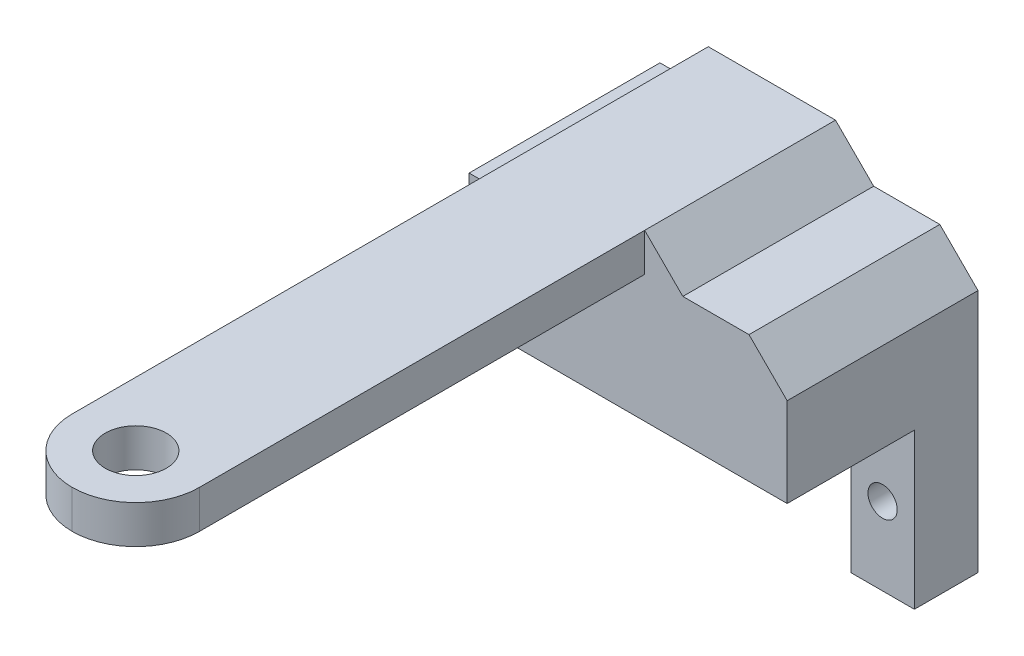
ISO-10303-21;
HEADER;
FILE_DESCRIPTION(('STEP AP214'),'2;1');
FILE_NAME('part.step','',(''),(''),'','','');
FILE_SCHEMA(('AUTOMOTIVE_DESIGN { 1 0 10303 214 1 1 1 1 }'));
ENDSEC;
DATA;
#1=APPLICATION_CONTEXT('core data for automotive mechanical design processes');
#2=APPLICATION_PROTOCOL_DEFINITION('international standard','automotive_design',2000,#1);
#3=PRODUCT_CONTEXT('',#1,'mechanical');
#4=PRODUCT('Part','Part','',(#3));
#5=PRODUCT_RELATED_PRODUCT_CATEGORY('part','',(#4));
#6=PRODUCT_DEFINITION_FORMATION('','',#4);
#7=PRODUCT_DEFINITION_CONTEXT('part definition',#1,'design');
#8=PRODUCT_DEFINITION('design','',#6,#7);
#9=PRODUCT_DEFINITION_SHAPE('','',#8);
#10=(LENGTH_UNIT() NAMED_UNIT(*) SI_UNIT(.MILLI.,.METRE.));
#11=(NAMED_UNIT(*) PLANE_ANGLE_UNIT() SI_UNIT($,.RADIAN.));
#12=(NAMED_UNIT(*) SI_UNIT($,.STERADIAN.) SOLID_ANGLE_UNIT());
#13=UNCERTAINTY_MEASURE_WITH_UNIT(LENGTH_MEASURE(1.E-05),#10,'distance_accuracy_value','');
#14=(GEOMETRIC_REPRESENTATION_CONTEXT(3) GLOBAL_UNCERTAINTY_ASSIGNED_CONTEXT((#13)) GLOBAL_UNIT_ASSIGNED_CONTEXT((#10,
#11,#12)) REPRESENTATION_CONTEXT('',''));
#15=CARTESIAN_POINT('',(0.,0.,0.));
#16=DIRECTION('',(0.,0.,1.));
#17=DIRECTION('',(1.,0.,0.));
#18=AXIS2_PLACEMENT_3D('',#15,#16,#17);
#19=CARTESIAN_POINT('',(0.,10.,0.));
#20=DIRECTION('',(0.,-1.,0.));
#21=DIRECTION('',(0.,0.,-1.));
#22=AXIS2_PLACEMENT_3D('',#19,#20,#21);
#23=PLANE('',#22);
#24=DIRECTION('',(1.,0.,0.));
#25=VECTOR('',#24,1.);
#26=CARTESIAN_POINT('',(16.2,10.,15.));
#27=LINE('',#26,#25);
#28=CARTESIAN_POINT('',(-8.8,10.,15.));
#29=VERTEX_POINT('',#28);
#30=CARTESIAN_POINT('',(-7.99999999999999,10.,15.));
#31=VERTEX_POINT('',#30);
#32=EDGE_CURVE('E199',#29,#31,#27,.T.);
#33=ORIENTED_EDGE('',*,*,#32,.T.);
#34=DIRECTION('',(0.,0.,-1.));
#35=VECTOR('',#34,1.);
#36=CARTESIAN_POINT('',(-7.99999999999999,10.,0.));
#37=LINE('',#36,#35);
#38=CARTESIAN_POINT('',(-7.99999999999999,10.,0.));
#39=VERTEX_POINT('',#38);
#40=EDGE_CURVE('E273',#31,#39,#37,.T.);
#41=ORIENTED_EDGE('',*,*,#40,.T.);
#42=DIRECTION('',(-1.,0.,0.));
#43=VECTOR('',#42,1.);
#44=CARTESIAN_POINT('',(16.2,10.,0.));
#45=LINE('',#44,#43);
#46=CARTESIAN_POINT('',(-8.8,10.,0.));
#47=VERTEX_POINT('',#46);
#48=EDGE_CURVE('E186',#39,#47,#45,.T.);
#49=ORIENTED_EDGE('',*,*,#48,.T.);
#50=DIRECTION('',(0.,0.,1.));
#51=VECTOR('',#50,1.);
#52=CARTESIAN_POINT('',(-8.8,10.,0.));
#53=LINE('',#52,#51);
#54=EDGE_CURVE('E194',#47,#29,#53,.T.);
#55=ORIENTED_EDGE('',*,*,#54,.T.);
#56=EDGE_LOOP('',(#33,#41,#49,#55));
#57=FACE_BOUND('',#56,.T.);
#58=ADVANCED_FACE('F41',(#57),#23,.F.);
#59=CARTESIAN_POINT('',(7.99999999999999,10.,15.));
#60=VERTEX_POINT('',#59);
#61=CARTESIAN_POINT('',(13.2,10.,15.));
#62=VERTEX_POINT('',#61);
#63=EDGE_CURVE('E193',#60,#62,#27,.T.);
#64=ORIENTED_EDGE('',*,*,#63,.T.);
#65=DIRECTION('',(0.,0.,-1.));
#66=VECTOR('',#65,1.);
#67=CARTESIAN_POINT('',(13.2,10.,0.));
#68=LINE('',#67,#66);
#69=CARTESIAN_POINT('',(13.2,10.,0.));
#70=VERTEX_POINT('',#69);
#71=EDGE_CURVE('E263',#62,#70,#68,.T.);
#72=ORIENTED_EDGE('',*,*,#71,.T.);
#73=CARTESIAN_POINT('',(7.99999999999999,10.,0.));
#74=VERTEX_POINT('',#73);
#75=EDGE_CURVE('E192',#70,#74,#45,.T.);
#76=ORIENTED_EDGE('',*,*,#75,.T.);
#77=DIRECTION('',(0.,0.,1.));
#78=VECTOR('',#77,1.);
#79=CARTESIAN_POINT('',(7.99999999999999,10.,15.));
#80=LINE('',#79,#78);
#81=EDGE_CURVE('E152',#74,#60,#80,.T.);
#82=ORIENTED_EDGE('',*,*,#81,.T.);
#83=EDGE_LOOP('',(#64,#72,#76,#82));
#84=FACE_BOUND('',#83,.T.);
#85=ADVANCED_FACE('F316',(#84),#23,.F.);
#86=CARTESIAN_POINT('',(11.2,-12.2,0.));
#87=DIRECTION('',(-1.,0.,0.));
#88=DIRECTION('',(0.,0.,1.));
#89=AXIS2_PLACEMENT_3D('',#86,#87,#88);
#90=PLANE('',#89);
#91=DIRECTION('',(0.,0.,1.));
#92=VECTOR('',#91,1.);
#93=CARTESIAN_POINT('',(11.2,0.,0.));
#94=LINE('',#93,#92);
#95=CARTESIAN_POINT('',(11.2,0.,0.));
#96=VERTEX_POINT('',#95);
#97=CARTESIAN_POINT('',(11.2,0.,5.));
#98=VERTEX_POINT('',#97);
#99=EDGE_CURVE('E216',#96,#98,#94,.T.);
#100=ORIENTED_EDGE('',*,*,#99,.F.);
#101=DIRECTION('',(0.,1.,0.));
#102=VECTOR('',#101,1.);
#103=CARTESIAN_POINT('',(11.2,-12.2,0.));
#104=LINE('',#103,#102);
#105=CARTESIAN_POINT('',(11.2,-12.2,0.));
#106=VERTEX_POINT('',#105);
#107=EDGE_CURVE('E238',#106,#96,#104,.T.);
#108=ORIENTED_EDGE('',*,*,#107,.F.);
#109=DIRECTION('',(0.,0.,1.));
#110=VECTOR('',#109,1.);
#111=CARTESIAN_POINT('',(11.2,-12.2,0.));
#112=LINE('',#111,#110);
#113=CARTESIAN_POINT('',(11.2,-12.2,5.));
#114=VERTEX_POINT('',#113);
#115=EDGE_CURVE('E217',#106,#114,#112,.T.);
#116=ORIENTED_EDGE('',*,*,#115,.T.);
#117=DIRECTION('',(0.,1.,0.));
#118=VECTOR('',#117,1.);
#119=CARTESIAN_POINT('',(11.2,-12.2,5.));
#120=LINE('',#119,#118);
#121=EDGE_CURVE('E231',#114,#98,#120,.T.);
#122=ORIENTED_EDGE('',*,*,#121,.T.);
#123=EDGE_LOOP('',(#100,#108,#116,#122));
#124=FACE_BOUND('',#123,.T.);
#125=ADVANCED_FACE('F323',(#124),#90,.T.);
#126=CARTESIAN_POINT('',(11.2,-12.2,0.));
#127=DIRECTION('',(0.,0.,-1.));
#128=DIRECTION('',(-1.,0.,0.));
#129=AXIS2_PLACEMENT_3D('',#126,#127,#128);
#130=PLANE('',#129);
#131=CARTESIAN_POINT('',(13.7,-6.1,0.));
#132=DIRECTION('',(0.,0.,-1.));
#133=DIRECTION('',(-1.,0.,0.));
#134=AXIS2_PLACEMENT_3D('',#131,#132,#133);
#135=CIRCLE('',#134,1.15);
#136=CARTESIAN_POINT('',(12.55,-6.1,0.));
#137=VERTEX_POINT('',#136);
#138=EDGE_CURVE('E211',#137,#137,#135,.T.);
#139=ORIENTED_EDGE('',*,*,#138,.F.);
#140=EDGE_LOOP('',(#139));
#141=FACE_BOUND('',#140,.T.);
#142=ORIENTED_EDGE('',*,*,#75,.F.);
#143=DIRECTION('',(0.707106781186546,-0.707106781186549,0.));
#144=VECTOR('',#143,1.);
#145=CARTESIAN_POINT('',(23.3,-0.100000000000053,0.));
#146=LINE('',#145,#144);
#147=CARTESIAN_POINT('',(16.2,7.,0.));
#148=VERTEX_POINT('',#147);
#149=EDGE_CURVE('E270',#70,#148,#146,.T.);
#150=ORIENTED_EDGE('',*,*,#149,.T.);
#151=DIRECTION('',(0.,1.,0.));
#152=VECTOR('',#151,1.);
#153=CARTESIAN_POINT('',(16.2,-12.2,0.));
#154=LINE('',#153,#152);
#155=CARTESIAN_POINT('',(16.2,-12.2,0.));
#156=VERTEX_POINT('',#155);
#157=EDGE_CURVE('E241',#156,#148,#154,.T.);
#158=ORIENTED_EDGE('',*,*,#157,.F.);
#159=DIRECTION('',(-1.,0.,0.));
#160=VECTOR('',#159,1.);
#161=CARTESIAN_POINT('',(11.2,-12.2,0.));
#162=LINE('',#161,#160);
#163=EDGE_CURVE('E229',#156,#106,#162,.T.);
#164=ORIENTED_EDGE('',*,*,#163,.T.);
#165=ORIENTED_EDGE('',*,*,#107,.T.);
#166=DIRECTION('',(-1.,0.,0.));
#167=VECTOR('',#166,1.);
#168=CARTESIAN_POINT('',(16.2,0.,0.));
#169=LINE('',#168,#167);
#170=CARTESIAN_POINT('',(-8.8,0.,0.));
#171=VERTEX_POINT('',#170);
#172=EDGE_CURVE('E178',#96,#171,#169,.T.);
#173=ORIENTED_EDGE('',*,*,#172,.T.);
#174=DIRECTION('',(0.,-1.,0.));
#175=VECTOR('',#174,1.);
#176=CARTESIAN_POINT('',(-8.8,10.,0.));
#177=LINE('',#176,#175);
#178=EDGE_CURVE('E208',#47,#171,#177,.T.);
#179=ORIENTED_EDGE('',*,*,#178,.F.);
#180=ORIENTED_EDGE('',*,*,#48,.F.);
#181=DIRECTION('',(-0.707106781186544,-0.707106781186551,0.));
#182=VECTOR('',#181,1.);
#183=CARTESIAN_POINT('',(-5.,13.,0.));
#184=LINE('',#183,#182);
#185=CARTESIAN_POINT('',(-5.,13.,0.));
#186=VERTEX_POINT('',#185);
#187=EDGE_CURVE('E159',#39,#186,#184,.F.);
#188=ORIENTED_EDGE('',*,*,#187,.T.);
#189=DIRECTION('',(-1.,0.,0.));
#190=VECTOR('',#189,1.);
#191=CARTESIAN_POINT('',(-5.,13.,0.));
#192=LINE('',#191,#190);
#193=CARTESIAN_POINT('',(5.,13.,0.));
#194=VERTEX_POINT('',#193);
#195=EDGE_CURVE('E168',#194,#186,#192,.T.);
#196=ORIENTED_EDGE('',*,*,#195,.F.);
#197=DIRECTION('',(-0.707106781186544,0.707106781186551,0.));
#198=VECTOR('',#197,1.);
#199=CARTESIAN_POINT('',(5.,13.,0.));
#200=LINE('',#199,#198);
#201=EDGE_CURVE('E49',#194,#74,#200,.F.);
#202=ORIENTED_EDGE('',*,*,#201,.T.);
#203=EDGE_LOOP('',(#142,#150,#158,#164,#165,#173,#179,#180,#188,#196,#202));
#204=FACE_BOUND('',#203,.T.);
#205=ADVANCED_FACE('F175',(#141,#204),#130,.T.);
#206=CARTESIAN_POINT('',(16.2,-12.2,0.));
#207=DIRECTION('',(1.,0.,0.));
#208=DIRECTION('',(0.,0.,-1.));
#209=AXIS2_PLACEMENT_3D('',#206,#207,#208);
#210=PLANE('',#209);
#211=ORIENTED_EDGE('',*,*,#157,.T.);
#212=DIRECTION('',(0.,0.,1.));
#213=VECTOR('',#212,1.);
#214=CARTESIAN_POINT('',(16.2,7.,15.));
#215=LINE('',#214,#213);
#216=CARTESIAN_POINT('',(16.2,7.,15.));
#217=VERTEX_POINT('',#216);
#218=EDGE_CURVE('E267',#148,#217,#215,.T.);
#219=ORIENTED_EDGE('',*,*,#218,.T.);
#220=DIRECTION('',(0.,-1.,0.));
#221=VECTOR('',#220,1.);
#222=CARTESIAN_POINT('',(16.2,10.,15.));
#223=LINE('',#222,#221);
#224=CARTESIAN_POINT('',(16.2,0.,15.));
#225=VERTEX_POINT('',#224);
#226=EDGE_CURVE('E200',#217,#225,#223,.T.);
#227=ORIENTED_EDGE('',*,*,#226,.T.);
#228=DIRECTION('',(0.,0.,-1.));
#229=VECTOR('',#228,1.);
#230=CARTESIAN_POINT('',(16.2,0.,0.));
#231=LINE('',#230,#229);
#232=CARTESIAN_POINT('',(16.2,0.,5.));
#233=VERTEX_POINT('',#232);
#234=EDGE_CURVE('E174',#225,#233,#231,.T.);
#235=ORIENTED_EDGE('',*,*,#234,.T.);
#236=DIRECTION('',(0.,1.,0.));
#237=VECTOR('',#236,1.);
#238=CARTESIAN_POINT('',(16.2,-12.2,5.));
#239=LINE('',#238,#237);
#240=CARTESIAN_POINT('',(16.2,-12.2,5.));
#241=VERTEX_POINT('',#240);
#242=EDGE_CURVE('E242',#241,#233,#239,.T.);
#243=ORIENTED_EDGE('',*,*,#242,.F.);
#244=DIRECTION('',(0.,0.,-1.));
#245=VECTOR('',#244,1.);
#246=CARTESIAN_POINT('',(16.2,-12.2,0.));
#247=LINE('',#246,#245);
#248=EDGE_CURVE('E227',#241,#156,#247,.T.);
#249=ORIENTED_EDGE('',*,*,#248,.T.);
#250=EDGE_LOOP('',(#211,#219,#227,#235,#243,#249));
#251=FACE_BOUND('',#250,.T.);
#252=ADVANCED_FACE('F353',(#251),#210,.T.);
#253=CARTESIAN_POINT('',(11.2,-12.2,5.));
#254=DIRECTION('',(0.,0.,1.));
#255=DIRECTION('',(1.,0.,0.));
#256=AXIS2_PLACEMENT_3D('',#253,#254,#255);
#257=PLANE('',#256);
#258=CARTESIAN_POINT('',(13.7,-6.1,5.));
#259=DIRECTION('',(0.,0.,1.));
#260=DIRECTION('',(1.,0.,0.));
#261=AXIS2_PLACEMENT_3D('',#258,#259,#260);
#262=CIRCLE('',#261,1.15);
#263=CARTESIAN_POINT('',(14.85,-6.1,5.));
#264=VERTEX_POINT('',#263);
#265=EDGE_CURVE('E214',#264,#264,#262,.F.);
#266=ORIENTED_EDGE('',*,*,#265,.T.);
#267=EDGE_LOOP('',(#266));
#268=FACE_BOUND('',#267,.T.);
#269=DIRECTION('',(1.,0.,0.));
#270=VECTOR('',#269,1.);
#271=CARTESIAN_POINT('',(11.2,0.,5.));
#272=LINE('',#271,#270);
#273=EDGE_CURVE('E222',#98,#233,#272,.T.);
#274=ORIENTED_EDGE('',*,*,#273,.F.);
#275=ORIENTED_EDGE('',*,*,#121,.F.);
#276=DIRECTION('',(1.,0.,0.));
#277=VECTOR('',#276,1.);
#278=CARTESIAN_POINT('',(11.2,-12.2,5.));
#279=LINE('',#278,#277);
#280=EDGE_CURVE('E221',#114,#241,#279,.T.);
#281=ORIENTED_EDGE('',*,*,#280,.T.);
#282=ORIENTED_EDGE('',*,*,#242,.T.);
#283=EDGE_LOOP('',(#274,#275,#281,#282));
#284=FACE_BOUND('',#283,.T.);
#285=ADVANCED_FACE('F346',(#268,#284),#257,.T.);
#286=CARTESIAN_POINT('',(0.,-12.2,0.));
#287=DIRECTION('',(0.,1.,0.));
#288=DIRECTION('',(0.,0.,1.));
#289=AXIS2_PLACEMENT_3D('',#286,#287,#288);
#290=PLANE('',#289);
#291=ORIENTED_EDGE('',*,*,#115,.F.);
#292=ORIENTED_EDGE('',*,*,#163,.F.);
#293=ORIENTED_EDGE('',*,*,#248,.F.);
#294=ORIENTED_EDGE('',*,*,#280,.F.);
#295=EDGE_LOOP('',(#291,#292,#293,#294));
#296=FACE_BOUND('',#295,.T.);
#297=ADVANCED_FACE('F344',(#296),#290,.F.);
#298=CARTESIAN_POINT('',(13.7,-6.1,5.001));
#299=DIRECTION('',(0.,0.,-1.));
#300=DIRECTION('',(-1.,0.,0.));
#301=AXIS2_PLACEMENT_3D('',#298,#299,#300);
#302=CYLINDRICAL_SURFACE('',#301,1.15);
#303=ORIENTED_EDGE('',*,*,#265,.F.);
#304=EDGE_LOOP('',(#303));
#305=FACE_BOUND('',#304,.T.);
#306=ORIENTED_EDGE('',*,*,#138,.T.);
#307=EDGE_LOOP('',(#306));
#308=FACE_BOUND('',#307,.T.);
#309=ADVANCED_FACE('F339',(#305,#308),#302,.F.);
#310=CARTESIAN_POINT('',(-8.8,10.,0.));
#311=DIRECTION('',(1.,0.,0.));
#312=DIRECTION('',(0.,0.,-1.));
#313=AXIS2_PLACEMENT_3D('',#310,#311,#312);
#314=PLANE('',#313);
#315=DIRECTION('',(0.,0.,1.));
#316=VECTOR('',#315,1.);
#317=CARTESIAN_POINT('',(-8.8,0.,0.));
#318=LINE('',#317,#316);
#319=CARTESIAN_POINT('',(-8.8,0.,15.));
#320=VERTEX_POINT('',#319);
#321=EDGE_CURVE('E205',#171,#320,#318,.T.);
#322=ORIENTED_EDGE('',*,*,#321,.T.);
#323=DIRECTION('',(0.,-1.,0.));
#324=VECTOR('',#323,1.);
#325=CARTESIAN_POINT('',(-8.8,10.,15.));
#326=LINE('',#325,#324);
#327=EDGE_CURVE('E210',#29,#320,#326,.T.);
#328=ORIENTED_EDGE('',*,*,#327,.F.);
#329=ORIENTED_EDGE('',*,*,#54,.F.);
#330=ORIENTED_EDGE('',*,*,#178,.T.);
#331=EDGE_LOOP('',(#322,#328,#329,#330));
#332=FACE_BOUND('',#331,.T.);
#333=ADVANCED_FACE('F337',(#332),#314,.F.);
#334=CARTESIAN_POINT('',(16.2,10.,15.));
#335=DIRECTION('',(0.,0.,-1.));
#336=DIRECTION('',(-1.,0.,0.));
#337=AXIS2_PLACEMENT_3D('',#334,#335,#336);
#338=PLANE('',#337);
#339=ORIENTED_EDGE('',*,*,#226,.F.);
#340=DIRECTION('',(-0.707106781186546,0.707106781186549,0.));
#341=VECTOR('',#340,1.);
#342=CARTESIAN_POINT('',(13.2,10.,15.));
#343=LINE('',#342,#341);
#344=EDGE_CURVE('E272',#217,#62,#343,.T.);
#345=ORIENTED_EDGE('',*,*,#344,.T.);
#346=ORIENTED_EDGE('',*,*,#63,.F.);
#347=DIRECTION('',(0.707106781186544,-0.707106781186551,0.));
#348=VECTOR('',#347,1.);
#349=CARTESIAN_POINT('',(12.1,5.89999999999999,15.));
#350=LINE('',#349,#348);
#351=CARTESIAN_POINT('',(5.,13.,15.));
#352=VERTEX_POINT('',#351);
#353=EDGE_CURVE('E11',#60,#352,#350,.F.);
#354=ORIENTED_EDGE('',*,*,#353,.T.);
#355=DIRECTION('',(0.,1.,0.));
#356=VECTOR('',#355,1.);
#357=CARTESIAN_POINT('',(5.,10.,15.));
#358=LINE('',#357,#356);
#359=CARTESIAN_POINT('',(5.,10.,15.));
#360=VERTEX_POINT('',#359);
#361=EDGE_CURVE('E57',#360,#352,#358,.T.);
#362=ORIENTED_EDGE('',*,*,#361,.F.);
#363=CARTESIAN_POINT('',(-5.,10.,15.));
#364=VERTEX_POINT('',#363);
#365=EDGE_CURVE('E198',#364,#360,#27,.T.);
#366=ORIENTED_EDGE('',*,*,#365,.F.);
#367=DIRECTION('',(0.,-1.,0.));
#368=VECTOR('',#367,1.);
#369=CARTESIAN_POINT('',(-5.,10.,15.));
#370=LINE('',#369,#368);
#371=CARTESIAN_POINT('',(-5.,13.,15.));
#372=VERTEX_POINT('',#371);
#373=EDGE_CURVE('E271',#372,#364,#370,.T.);
#374=ORIENTED_EDGE('',*,*,#373,.F.);
#375=DIRECTION('',(0.707106781186544,0.707106781186551,0.));
#376=VECTOR('',#375,1.);
#377=CARTESIAN_POINT('',(4.0999999999999,22.1,15.));
#378=LINE('',#377,#376);
#379=EDGE_CURVE('E279',#372,#31,#378,.F.);
#380=ORIENTED_EDGE('',*,*,#379,.T.);
#381=ORIENTED_EDGE('',*,*,#32,.F.);
#382=ORIENTED_EDGE('',*,*,#327,.T.);
#383=DIRECTION('',(1.,0.,0.));
#384=VECTOR('',#383,1.);
#385=CARTESIAN_POINT('',(16.2,0.,15.));
#386=LINE('',#385,#384);
#387=EDGE_CURVE('E195',#320,#225,#386,.T.);
#388=ORIENTED_EDGE('',*,*,#387,.T.);
#389=EDGE_LOOP('',(#339,#345,#346,#354,#362,#366,#374,#380,#381,#382,#388));
#390=FACE_BOUND('',#389,.T.);
#391=ADVANCED_FACE('F285',(#390),#338,.F.);
#392=CARTESIAN_POINT('',(0.,0.,0.));
#393=DIRECTION('',(0.,-1.,0.));
#394=DIRECTION('',(0.,0.,-1.));
#395=AXIS2_PLACEMENT_3D('',#392,#393,#394);
#396=PLANE('',#395);
#397=ORIENTED_EDGE('',*,*,#172,.F.);
#398=ORIENTED_EDGE('',*,*,#99,.T.);
#399=ORIENTED_EDGE('',*,*,#273,.T.);
#400=ORIENTED_EDGE('',*,*,#234,.F.);
#401=ORIENTED_EDGE('',*,*,#387,.F.);
#402=ORIENTED_EDGE('',*,*,#321,.F.);
#403=EDGE_LOOP('',(#397,#398,#399,#400,#401,#402));
#404=FACE_BOUND('',#403,.T.);
#405=ADVANCED_FACE('F328',(#404),#396,.T.);
#406=CARTESIAN_POINT('',(0.,10.,0.));
#407=DIRECTION('',(0.,1.,0.));
#408=DIRECTION('',(0.,0.,1.));
#409=AXIS2_PLACEMENT_3D('',#406,#407,#408);
#410=PLANE('',#409);
#411=CARTESIAN_POINT('',(0.,10.,50.));
#412=DIRECTION('',(0.,1.,0.));
#413=DIRECTION('',(0.,0.,1.));
#414=AXIS2_PLACEMENT_3D('',#411,#412,#413);
#415=CIRCLE('',#414,2.4);
#416=CARTESIAN_POINT('',(0.,10.,52.4));
#417=VERTEX_POINT('',#416);
#418=EDGE_CURVE('E261',#417,#417,#415,.F.);
#419=ORIENTED_EDGE('',*,*,#418,.F.);
#420=EDGE_LOOP('',(#419));
#421=FACE_BOUND('',#420,.T.);
#422=DIRECTION('',(0.,0.,-1.));
#423=VECTOR('',#422,1.);
#424=CARTESIAN_POINT('',(5.,10.,0.));
#425=LINE('',#424,#423);
#426=CARTESIAN_POINT('',(4.99999999999999,10.,50.));
#427=VERTEX_POINT('',#426);
#428=EDGE_CURVE('E184',#427,#360,#425,.T.);
#429=ORIENTED_EDGE('',*,*,#428,.F.);
#430=CARTESIAN_POINT('',(0.,10.,50.));
#431=DIRECTION('',(0.,1.,0.));
#432=DIRECTION('',(0.,0.,1.));
#433=AXIS2_PLACEMENT_3D('',#430,#431,#432);
#434=CIRCLE('',#433,5.);
#435=CARTESIAN_POINT('',(0.,10.,55.));
#436=VERTEX_POINT('',#435);
#437=EDGE_CURVE('E252',#427,#436,#434,.F.);
#438=ORIENTED_EDGE('',*,*,#437,.T.);
#439=CARTESIAN_POINT('',(0.,10.,50.));
#440=DIRECTION('',(0.,1.,0.));
#441=DIRECTION('',(0.,0.,1.));
#442=AXIS2_PLACEMENT_3D('',#439,#440,#441);
#443=CIRCLE('',#442,5.);
#444=CARTESIAN_POINT('',(-4.99999999999999,10.,50.));
#445=VERTEX_POINT('',#444);
#446=EDGE_CURVE('E248',#436,#445,#443,.F.);
#447=ORIENTED_EDGE('',*,*,#446,.T.);
#448=DIRECTION('',(0.,0.,1.));
#449=VECTOR('',#448,1.);
#450=CARTESIAN_POINT('',(-5.,10.,0.));
#451=LINE('',#450,#449);
#452=EDGE_CURVE('E185',#364,#445,#451,.T.);
#453=ORIENTED_EDGE('',*,*,#452,.F.);
#454=ORIENTED_EDGE('',*,*,#365,.T.);
#455=EDGE_LOOP('',(#429,#438,#447,#453,#454));
#456=FACE_BOUND('',#455,.T.);
#457=ADVANCED_FACE('F335',(#421,#456),#410,.F.);
#458=CARTESIAN_POINT('',(-5.,13.,0.));
#459=DIRECTION('',(1.,0.,0.));
#460=DIRECTION('',(0.,0.,-1.));
#461=AXIS2_PLACEMENT_3D('',#458,#459,#460);
#462=PLANE('',#461);
#463=DIRECTION('',(0.,0.,1.));
#464=VECTOR('',#463,1.);
#465=CARTESIAN_POINT('',(-5.,13.,0.));
#466=LINE('',#465,#464);
#467=CARTESIAN_POINT('',(-4.99999999999999,13.,50.));
#468=VERTEX_POINT('',#467);
#469=EDGE_CURVE('E189',#372,#468,#466,.T.);
#470=ORIENTED_EDGE('',*,*,#469,.F.);
#471=ORIENTED_EDGE('',*,*,#373,.T.);
#472=ORIENTED_EDGE('',*,*,#452,.T.);
#473=DIRECTION('',(0.,-1.,0.));
#474=VECTOR('',#473,1.);
#475=CARTESIAN_POINT('',(-4.99999999999999,13.,50.));
#476=LINE('',#475,#474);
#477=EDGE_CURVE('E260',#445,#468,#476,.F.);
#478=ORIENTED_EDGE('',*,*,#477,.T.);
#479=EDGE_LOOP('',(#470,#471,#472,#478));
#480=FACE_BOUND('',#479,.T.);
#481=ADVANCED_FACE('F312',(#480),#462,.F.);
#482=CARTESIAN_POINT('',(5.,13.,0.));
#483=DIRECTION('',(-1.,0.,0.));
#484=DIRECTION('',(0.,0.,1.));
#485=AXIS2_PLACEMENT_3D('',#482,#483,#484);
#486=PLANE('',#485);
#487=ORIENTED_EDGE('',*,*,#428,.T.);
#488=ORIENTED_EDGE('',*,*,#361,.T.);
#489=DIRECTION('',(0.,0.,-1.));
#490=VECTOR('',#489,1.);
#491=CARTESIAN_POINT('',(5.,13.,0.));
#492=LINE('',#491,#490);
#493=CARTESIAN_POINT('',(4.99999999999999,13.,50.));
#494=VERTEX_POINT('',#493);
#495=EDGE_CURVE('E169',#494,#352,#492,.T.);
#496=ORIENTED_EDGE('',*,*,#495,.F.);
#497=DIRECTION('',(0.,-1.,0.));
#498=VECTOR('',#497,1.);
#499=CARTESIAN_POINT('',(4.99999999999999,13.,50.));
#500=LINE('',#499,#498);
#501=EDGE_CURVE('E239',#494,#427,#500,.T.);
#502=ORIENTED_EDGE('',*,*,#501,.T.);
#503=EDGE_LOOP('',(#487,#488,#496,#502));
#504=FACE_BOUND('',#503,.T.);
#505=ADVANCED_FACE('F303',(#504),#486,.F.);
#506=CARTESIAN_POINT('',(0.,13.,0.));
#507=DIRECTION('',(0.,1.,0.));
#508=DIRECTION('',(0.,0.,1.));
#509=AXIS2_PLACEMENT_3D('',#506,#507,#508);
#510=PLANE('',#509);
#511=CARTESIAN_POINT('',(0.,13.,50.));
#512=DIRECTION('',(0.,1.,0.));
#513=DIRECTION('',(0.,0.,1.));
#514=AXIS2_PLACEMENT_3D('',#511,#512,#513);
#515=CIRCLE('',#514,2.4);
#516=CARTESIAN_POINT('',(0.,13.,52.4));
#517=VERTEX_POINT('',#516);
#518=EDGE_CURVE('E295',#517,#517,#515,.T.);
#519=ORIENTED_EDGE('',*,*,#518,.F.);
#520=EDGE_LOOP('',(#519));
#521=FACE_BOUND('',#520,.T.);
#522=CARTESIAN_POINT('',(0.,13.,50.));
#523=DIRECTION('',(0.,1.,0.));
#524=DIRECTION('',(0.,0.,1.));
#525=AXIS2_PLACEMENT_3D('',#522,#523,#524);
#526=CIRCLE('',#525,5.);
#527=CARTESIAN_POINT('',(0.,13.,55.));
#528=VERTEX_POINT('',#527);
#529=EDGE_CURVE('E254',#468,#528,#526,.T.);
#530=ORIENTED_EDGE('',*,*,#529,.T.);
#531=CARTESIAN_POINT('',(0.,13.,50.));
#532=DIRECTION('',(0.,1.,0.));
#533=DIRECTION('',(0.,0.,1.));
#534=AXIS2_PLACEMENT_3D('',#531,#532,#533);
#535=CIRCLE('',#534,5.);
#536=EDGE_CURVE('E253',#528,#494,#535,.T.);
#537=ORIENTED_EDGE('',*,*,#536,.T.);
#538=ORIENTED_EDGE('',*,*,#495,.T.);
#539=EDGE_CURVE('E153',#352,#194,#492,.T.);
#540=ORIENTED_EDGE('',*,*,#539,.T.);
#541=ORIENTED_EDGE('',*,*,#195,.T.);
#542=EDGE_CURVE('E167',#186,#372,#466,.T.);
#543=ORIENTED_EDGE('',*,*,#542,.T.);
#544=ORIENTED_EDGE('',*,*,#469,.T.);
#545=EDGE_LOOP('',(#530,#537,#538,#540,#541,#543,#544));
#546=FACE_BOUND('',#545,.T.);
#547=ADVANCED_FACE('F165',(#521,#546),#510,.T.);
#548=CARTESIAN_POINT('',(0.,13.,50.));
#549=DIRECTION('',(0.,-1.,0.));
#550=DIRECTION('',(0.,0.,-1.));
#551=AXIS2_PLACEMENT_3D('',#548,#549,#550);
#552=CYLINDRICAL_SURFACE('',#551,5.);
#553=DIRECTION('',(0.,-1.,0.));
#554=VECTOR('',#553,1.);
#555=CARTESIAN_POINT('',(0.,13.,55.));
#556=LINE('',#555,#554);
#557=EDGE_CURVE('E187',#528,#436,#556,.T.);
#558=ORIENTED_EDGE('',*,*,#557,.F.);
#559=ORIENTED_EDGE('',*,*,#529,.F.);
#560=ORIENTED_EDGE('',*,*,#477,.F.);
#561=ORIENTED_EDGE('',*,*,#446,.F.);
#562=EDGE_LOOP('',(#558,#559,#560,#561));
#563=FACE_BOUND('',#562,.T.);
#564=ADVANCED_FACE('F305',(#563),#552,.T.);
#565=CARTESIAN_POINT('',(0.,13.,50.));
#566=DIRECTION('',(0.,-1.,0.));
#567=DIRECTION('',(0.,0.,-1.));
#568=AXIS2_PLACEMENT_3D('',#565,#566,#567);
#569=CYLINDRICAL_SURFACE('',#568,5.);
#570=ORIENTED_EDGE('',*,*,#536,.F.);
#571=ORIENTED_EDGE('',*,*,#557,.T.);
#572=ORIENTED_EDGE('',*,*,#437,.F.);
#573=ORIENTED_EDGE('',*,*,#501,.F.);
#574=EDGE_LOOP('',(#570,#571,#572,#573));
#575=FACE_BOUND('',#574,.T.);
#576=ADVANCED_FACE('F309',(#575),#569,.T.);
#577=CARTESIAN_POINT('',(0.,-12.201,50.));
#578=DIRECTION('',(0.,1.,0.));
#579=DIRECTION('',(0.,0.,1.));
#580=AXIS2_PLACEMENT_3D('',#577,#578,#579);
#581=CYLINDRICAL_SURFACE('',#580,2.4);
#582=ORIENTED_EDGE('',*,*,#518,.T.);
#583=EDGE_LOOP('',(#582));
#584=FACE_BOUND('',#583,.T.);
#585=ORIENTED_EDGE('',*,*,#418,.T.);
#586=EDGE_LOOP('',(#585));
#587=FACE_BOUND('',#586,.T.);
#588=ADVANCED_FACE('F296',(#584,#587),#581,.F.);
#589=CARTESIAN_POINT('',(13.2,10.,0.));
#590=DIRECTION('',(0.707106781186549,0.707106781186546,0.));
#591=DIRECTION('',(0.,0.,1.));
#592=AXIS2_PLACEMENT_3D('',#589,#590,#591);
#593=PLANE('',#592);
#594=ORIENTED_EDGE('',*,*,#344,.F.);
#595=ORIENTED_EDGE('',*,*,#218,.F.);
#596=ORIENTED_EDGE('',*,*,#149,.F.);
#597=ORIENTED_EDGE('',*,*,#71,.F.);
#598=EDGE_LOOP('',(#594,#595,#596,#597));
#599=FACE_BOUND('',#598,.T.);
#600=ADVANCED_FACE('F366',(#599),#593,.T.);
#601=CARTESIAN_POINT('',(-5.,13.,0.));
#602=DIRECTION('',(-0.707106781186551,0.707106781186544,0.));
#603=DIRECTION('',(0.,0.,-1.));
#604=AXIS2_PLACEMENT_3D('',#601,#602,#603);
#605=PLANE('',#604);
#606=ORIENTED_EDGE('',*,*,#187,.F.);
#607=ORIENTED_EDGE('',*,*,#40,.F.);
#608=ORIENTED_EDGE('',*,*,#379,.F.);
#609=ORIENTED_EDGE('',*,*,#542,.F.);
#610=EDGE_LOOP('',(#606,#607,#608,#609));
#611=FACE_BOUND('',#610,.T.);
#612=ADVANCED_FACE('F289',(#611),#605,.T.);
#613=CARTESIAN_POINT('',(5.,13.,0.));
#614=DIRECTION('',(0.707106781186551,0.707106781186544,0.));
#615=DIRECTION('',(0.,0.,1.));
#616=AXIS2_PLACEMENT_3D('',#613,#614,#615);
#617=PLANE('',#616);
#618=ORIENTED_EDGE('',*,*,#353,.F.);
#619=ORIENTED_EDGE('',*,*,#81,.F.);
#620=ORIENTED_EDGE('',*,*,#201,.F.);
#621=ORIENTED_EDGE('',*,*,#539,.F.);
#622=EDGE_LOOP('',(#618,#619,#620,#621));
#623=FACE_BOUND('',#622,.T.);
#624=ADVANCED_FACE('F42',(#623),#617,.T.);
#625=CLOSED_SHELL('',(#58,#85,#125,#205,#252,#285,#297,#309,#333,#391,#405,#457,#481,#505,#547,
#564,#576,#588,#600,#612,#624));
#626=MANIFOLD_SOLID_BREP('B2',#625);
#627=ADVANCED_BREP_SHAPE_REPRESENTATION('',(#18,#626),#14);
#628=SHAPE_DEFINITION_REPRESENTATION(#9,#627);
ENDSEC;
END-ISO-10303-21;
